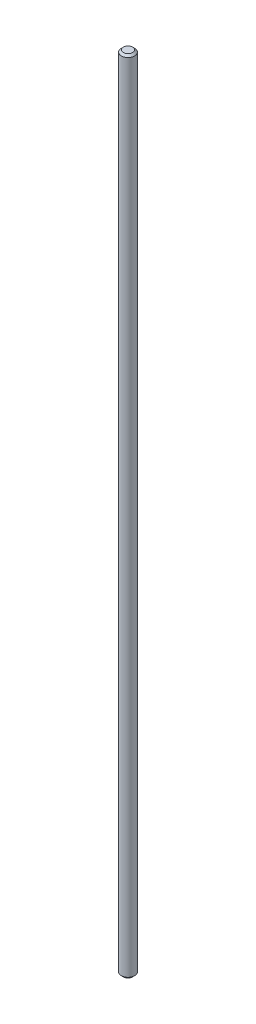
ISO-10303-21;
HEADER;
FILE_DESCRIPTION(('STEP AP214'),'2;1');
FILE_NAME('part.step','',(''),(''),'','','');
FILE_SCHEMA(('AUTOMOTIVE_DESIGN { 1 0 10303 214 1 1 1 1 }'));
ENDSEC;
DATA;
#1=APPLICATION_CONTEXT('core data for automotive mechanical design processes');
#2=APPLICATION_PROTOCOL_DEFINITION('international standard','automotive_design',2000,#1);
#3=PRODUCT_CONTEXT('',#1,'mechanical');
#4=PRODUCT('Part','Part','',(#3));
#5=PRODUCT_RELATED_PRODUCT_CATEGORY('part','',(#4));
#6=PRODUCT_DEFINITION_FORMATION('','',#4);
#7=PRODUCT_DEFINITION_CONTEXT('part definition',#1,'design');
#8=PRODUCT_DEFINITION('design','',#6,#7);
#9=PRODUCT_DEFINITION_SHAPE('','',#8);
#10=(LENGTH_UNIT() NAMED_UNIT(*) SI_UNIT(.MILLI.,.METRE.));
#11=(NAMED_UNIT(*) PLANE_ANGLE_UNIT() SI_UNIT($,.RADIAN.));
#12=(NAMED_UNIT(*) SI_UNIT($,.STERADIAN.) SOLID_ANGLE_UNIT());
#13=UNCERTAINTY_MEASURE_WITH_UNIT(LENGTH_MEASURE(1.E-05),#10,'distance_accuracy_value','');
#14=(GEOMETRIC_REPRESENTATION_CONTEXT(3) GLOBAL_UNCERTAINTY_ASSIGNED_CONTEXT((#13)) GLOBAL_UNIT_ASSIGNED_CONTEXT((#10,
#11,#12)) REPRESENTATION_CONTEXT('',''));
#15=CARTESIAN_POINT('',(0.,0.,0.));
#16=DIRECTION('',(0.,0.,1.));
#17=DIRECTION('',(1.,0.,0.));
#18=AXIS2_PLACEMENT_3D('',#15,#16,#17);
#19=CARTESIAN_POINT('',(0.,300.,0.));
#20=DIRECTION('',(0.,-1.,0.));
#21=DIRECTION('',(0.,0.,-1.));
#22=AXIS2_PLACEMENT_3D('',#19,#20,#21);
#23=CYLINDRICAL_SURFACE('',#22,2.5);
#24=CARTESIAN_POINT('',(0.,0.749999999999917,0.));
#25=DIRECTION('',(0.,1.,0.));
#26=DIRECTION('',(0.,0.,1.));
#27=AXIS2_PLACEMENT_3D('',#24,#25,#26);
#28=CIRCLE('',#27,2.5);
#29=CARTESIAN_POINT('',(0.,0.749999999999917,2.5));
#30=VERTEX_POINT('',#29);
#31=EDGE_CURVE('E53',#30,#30,#28,.T.);
#32=ORIENTED_EDGE('',*,*,#31,.T.);
#33=EDGE_LOOP('',(#32));
#34=FACE_BOUND('',#33,.T.);
#35=CARTESIAN_POINT('',(0.,299.25,0.));
#36=DIRECTION('',(0.,1.,0.));
#37=DIRECTION('',(0.,0.,1.));
#38=AXIS2_PLACEMENT_3D('',#35,#36,#37);
#39=CIRCLE('',#38,2.5);
#40=CARTESIAN_POINT('',(0.,299.25,2.5));
#41=VERTEX_POINT('',#40);
#42=EDGE_CURVE('E58',#41,#41,#39,.F.);
#43=ORIENTED_EDGE('',*,*,#42,.T.);
#44=EDGE_LOOP('',(#43));
#45=FACE_BOUND('',#44,.T.);
#46=ADVANCED_FACE('F39',(#34,#45),#23,.T.);
#47=CARTESIAN_POINT('',(0.,300.,0.));
#48=DIRECTION('',(0.,1.,0.));
#49=DIRECTION('',(0.,0.,1.));
#50=AXIS2_PLACEMENT_3D('',#47,#48,#49);
#51=PLANE('',#50);
#52=CARTESIAN_POINT('',(0.,300.,0.));
#53=DIRECTION('',(0.,1.,0.));
#54=DIRECTION('',(0.,0.,1.));
#55=AXIS2_PLACEMENT_3D('',#52,#53,#54);
#56=CIRCLE('',#55,1.75);
#57=CARTESIAN_POINT('',(0.,300.,1.75));
#58=VERTEX_POINT('',#57);
#59=EDGE_CURVE('E10',#58,#58,#56,.T.);
#60=ORIENTED_EDGE('',*,*,#59,.T.);
#61=EDGE_LOOP('',(#60));
#62=FACE_BOUND('',#61,.T.);
#63=ADVANCED_FACE('F75',(#62),#51,.T.);
#64=CARTESIAN_POINT('',(0.,0.,0.));
#65=DIRECTION('',(0.,1.,0.));
#66=DIRECTION('',(0.,0.,1.));
#67=AXIS2_PLACEMENT_3D('',#64,#65,#66);
#68=PLANE('',#67);
#69=CARTESIAN_POINT('',(0.,0.,0.));
#70=DIRECTION('',(0.,1.,0.));
#71=DIRECTION('',(0.,0.,1.));
#72=AXIS2_PLACEMENT_3D('',#69,#70,#71);
#73=CIRCLE('',#72,1.75000000000008);
#74=CARTESIAN_POINT('',(0.,0.,1.75000000000008));
#75=VERTEX_POINT('',#74);
#76=EDGE_CURVE('E48',#75,#75,#73,.F.);
#77=ORIENTED_EDGE('',*,*,#76,.T.);
#78=EDGE_LOOP('',(#77));
#79=FACE_BOUND('',#78,.T.);
#80=ADVANCED_FACE('F72',(#79),#68,.F.);
#81=CARTESIAN_POINT('',(0.,0.749999999999917,0.));
#82=DIRECTION('',(0.,1.,0.));
#83=DIRECTION('',(0.,0.,1.));
#84=AXIS2_PLACEMENT_3D('',#81,#82,#83);
#85=CONICAL_SURFACE('',#84,2.5,0.785398163397447);
#86=ORIENTED_EDGE('',*,*,#76,.F.);
#87=EDGE_LOOP('',(#86));
#88=FACE_BOUND('',#87,.T.);
#89=ORIENTED_EDGE('',*,*,#31,.F.);
#90=EDGE_LOOP('',(#89));
#91=FACE_BOUND('',#90,.T.);
#92=ADVANCED_FACE('F68',(#88,#91),#85,.T.);
#93=CARTESIAN_POINT('',(0.,300.,0.));
#94=DIRECTION('',(0.,-1.,0.));
#95=DIRECTION('',(0.,0.,-1.));
#96=AXIS2_PLACEMENT_3D('',#93,#94,#95);
#97=CONICAL_SURFACE('',#96,1.75,0.785398163397465);
#98=ORIENTED_EDGE('',*,*,#42,.F.);
#99=EDGE_LOOP('',(#98));
#100=FACE_BOUND('',#99,.T.);
#101=ORIENTED_EDGE('',*,*,#59,.F.);
#102=EDGE_LOOP('',(#101));
#103=FACE_BOUND('',#102,.T.);
#104=ADVANCED_FACE('F42',(#100,#103),#97,.T.);
#105=CLOSED_SHELL('',(#46,#63,#80,#92,#104));
#106=MANIFOLD_SOLID_BREP('B2',#105);
#107=ADVANCED_BREP_SHAPE_REPRESENTATION('',(#18,#106),#14);
#108=SHAPE_DEFINITION_REPRESENTATION(#9,#107);
ENDSEC;
END-ISO-10303-21;
